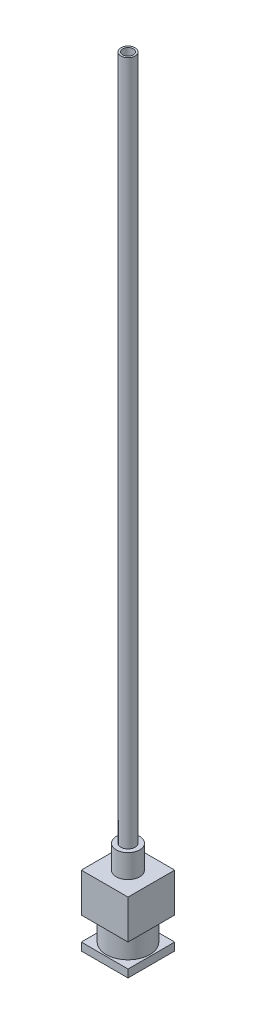
ISO-10303-21;
HEADER;
FILE_DESCRIPTION(('STEP AP214'),'2;1');
FILE_NAME('part.step','',(''),(''),'','','');
FILE_SCHEMA(('AUTOMOTIVE_DESIGN { 1 0 10303 214 1 1 1 1 }'));
ENDSEC;
DATA;
#1=APPLICATION_CONTEXT('core data for automotive mechanical design processes');
#2=APPLICATION_PROTOCOL_DEFINITION('international standard','automotive_design',2000,#1);
#3=PRODUCT_CONTEXT('',#1,'mechanical');
#4=PRODUCT('Part','Part','',(#3));
#5=PRODUCT_RELATED_PRODUCT_CATEGORY('part','',(#4));
#6=PRODUCT_DEFINITION_FORMATION('','',#4);
#7=PRODUCT_DEFINITION_CONTEXT('part definition',#1,'design');
#8=PRODUCT_DEFINITION('design','',#6,#7);
#9=PRODUCT_DEFINITION_SHAPE('','',#8);
#10=(LENGTH_UNIT() NAMED_UNIT(*) SI_UNIT(.MILLI.,.METRE.));
#11=(NAMED_UNIT(*) PLANE_ANGLE_UNIT() SI_UNIT($,.RADIAN.));
#12=(NAMED_UNIT(*) SI_UNIT($,.STERADIAN.) SOLID_ANGLE_UNIT());
#13=UNCERTAINTY_MEASURE_WITH_UNIT(LENGTH_MEASURE(1.E-05),#10,'distance_accuracy_value','');
#14=(GEOMETRIC_REPRESENTATION_CONTEXT(3) GLOBAL_UNCERTAINTY_ASSIGNED_CONTEXT((#13)) GLOBAL_UNIT_ASSIGNED_CONTEXT((#10,
#11,#12)) REPRESENTATION_CONTEXT('',''));
#15=CARTESIAN_POINT('',(0.,0.,0.));
#16=DIRECTION('',(0.,0.,1.));
#17=DIRECTION('',(1.,0.,0.));
#18=AXIS2_PLACEMENT_3D('',#15,#16,#17);
#19=CARTESIAN_POINT('',(-3.,9.,3.));
#20=DIRECTION('',(1.,0.,0.));
#21=DIRECTION('',(0.,0.,-1.));
#22=AXIS2_PLACEMENT_3D('',#19,#20,#21);
#23=PLANE('',#22);
#24=DIRECTION('',(0.,-1.,0.));
#25=VECTOR('',#24,1.);
#26=CARTESIAN_POINT('',(-3.,9.,3.));
#27=LINE('',#26,#25);
#28=CARTESIAN_POINT('',(-3.,1.,3.));
#29=VERTEX_POINT('',#28);
#30=CARTESIAN_POINT('',(-3.,0.,3.));
#31=VERTEX_POINT('',#30);
#32=EDGE_CURVE('E129',#29,#31,#27,.T.);
#33=ORIENTED_EDGE('',*,*,#32,.F.);
#34=DIRECTION('',(0.,0.,-1.));
#35=VECTOR('',#34,1.);
#36=CARTESIAN_POINT('',(-3.,1.,3.));
#37=LINE('',#36,#35);
#38=CARTESIAN_POINT('',(-3.,1.,-3.));
#39=VERTEX_POINT('',#38);
#40=EDGE_CURVE('E105',#29,#39,#37,.T.);
#41=ORIENTED_EDGE('',*,*,#40,.T.);
#42=DIRECTION('',(0.,-1.,0.));
#43=VECTOR('',#42,1.);
#44=CARTESIAN_POINT('',(-3.,9.,-3.));
#45=LINE('',#44,#43);
#46=CARTESIAN_POINT('',(-3.,0.,-3.));
#47=VERTEX_POINT('',#46);
#48=EDGE_CURVE('E147',#39,#47,#45,.T.);
#49=ORIENTED_EDGE('',*,*,#48,.T.);
#50=DIRECTION('',(0.,0.,1.));
#51=VECTOR('',#50,1.);
#52=CARTESIAN_POINT('',(-3.,0.,3.));
#53=LINE('',#52,#51);
#54=EDGE_CURVE('E143',#47,#31,#53,.T.);
#55=ORIENTED_EDGE('',*,*,#54,.T.);
#56=EDGE_LOOP('',(#33,#41,#49,#55));
#57=FACE_BOUND('',#56,.T.);
#58=ADVANCED_FACE('F37',(#57),#23,.F.);
#59=CARTESIAN_POINT('',(3.,9.,3.));
#60=DIRECTION('',(0.,0.,-1.));
#61=DIRECTION('',(-1.,0.,0.));
#62=AXIS2_PLACEMENT_3D('',#59,#60,#61);
#63=PLANE('',#62);
#64=DIRECTION('',(0.,-1.,0.));
#65=VECTOR('',#64,1.);
#66=CARTESIAN_POINT('',(3.,9.,3.));
#67=LINE('',#66,#65);
#68=CARTESIAN_POINT('',(3.,1.,3.));
#69=VERTEX_POINT('',#68);
#70=CARTESIAN_POINT('',(3.,0.,3.));
#71=VERTEX_POINT('',#70);
#72=EDGE_CURVE('E115',#69,#71,#67,.T.);
#73=ORIENTED_EDGE('',*,*,#72,.F.);
#74=DIRECTION('',(-1.,0.,0.));
#75=VECTOR('',#74,1.);
#76=CARTESIAN_POINT('',(3.,1.,3.));
#77=LINE('',#76,#75);
#78=EDGE_CURVE('E102',#69,#29,#77,.T.);
#79=ORIENTED_EDGE('',*,*,#78,.T.);
#80=ORIENTED_EDGE('',*,*,#32,.T.);
#81=DIRECTION('',(1.,0.,0.));
#82=VECTOR('',#81,1.);
#83=CARTESIAN_POINT('',(3.,0.,3.));
#84=LINE('',#83,#82);
#85=EDGE_CURVE('E123',#31,#71,#84,.T.);
#86=ORIENTED_EDGE('',*,*,#85,.T.);
#87=EDGE_LOOP('',(#73,#79,#80,#86));
#88=FACE_BOUND('',#87,.T.);
#89=ADVANCED_FACE('F121',(#88),#63,.F.);
#90=CARTESIAN_POINT('',(3.,9.,3.));
#91=DIRECTION('',(-1.,0.,0.));
#92=DIRECTION('',(0.,0.,1.));
#93=AXIS2_PLACEMENT_3D('',#90,#91,#92);
#94=PLANE('',#93);
#95=DIRECTION('',(0.,-1.,0.));
#96=VECTOR('',#95,1.);
#97=CARTESIAN_POINT('',(3.,9.,-3.));
#98=LINE('',#97,#96);
#99=CARTESIAN_POINT('',(3.,0.999999999999999,-3.));
#100=VERTEX_POINT('',#99);
#101=CARTESIAN_POINT('',(3.,0.,-3.));
#102=VERTEX_POINT('',#101);
#103=EDGE_CURVE('E117',#100,#102,#98,.T.);
#104=ORIENTED_EDGE('',*,*,#103,.F.);
#105=DIRECTION('',(0.,0.,1.));
#106=VECTOR('',#105,1.);
#107=CARTESIAN_POINT('',(3.,1.,-3.));
#108=LINE('',#107,#106);
#109=EDGE_CURVE('E54',#100,#69,#108,.T.);
#110=ORIENTED_EDGE('',*,*,#109,.T.);
#111=ORIENTED_EDGE('',*,*,#72,.T.);
#112=DIRECTION('',(0.,0.,-1.));
#113=VECTOR('',#112,1.);
#114=CARTESIAN_POINT('',(3.,0.,3.));
#115=LINE('',#114,#113);
#116=EDGE_CURVE('E144',#71,#102,#115,.T.);
#117=ORIENTED_EDGE('',*,*,#116,.T.);
#118=EDGE_LOOP('',(#104,#110,#111,#117));
#119=FACE_BOUND('',#118,.T.);
#120=ADVANCED_FACE('F113',(#119),#94,.F.);
#121=CARTESIAN_POINT('',(3.,9.,-3.));
#122=DIRECTION('',(0.,0.,1.));
#123=DIRECTION('',(1.,0.,0.));
#124=AXIS2_PLACEMENT_3D('',#121,#122,#123);
#125=PLANE('',#124);
#126=ORIENTED_EDGE('',*,*,#48,.F.);
#127=DIRECTION('',(1.,0.,0.));
#128=VECTOR('',#127,1.);
#129=CARTESIAN_POINT('',(-3.,1.,-3.));
#130=LINE('',#129,#128);
#131=EDGE_CURVE('E119',#39,#100,#130,.T.);
#132=ORIENTED_EDGE('',*,*,#131,.T.);
#133=ORIENTED_EDGE('',*,*,#103,.T.);
#134=DIRECTION('',(-1.,0.,0.));
#135=VECTOR('',#134,1.);
#136=CARTESIAN_POINT('',(3.,0.,-3.));
#137=LINE('',#136,#135);
#138=EDGE_CURVE('E159',#102,#47,#137,.T.);
#139=ORIENTED_EDGE('',*,*,#138,.T.);
#140=EDGE_LOOP('',(#126,#132,#133,#139));
#141=FACE_BOUND('',#140,.T.);
#142=ADVANCED_FACE('F203',(#141),#125,.F.);
#143=CARTESIAN_POINT('',(0.,0.,0.));
#144=DIRECTION('',(0.,1.,0.));
#145=DIRECTION('',(0.,0.,1.));
#146=AXIS2_PLACEMENT_3D('',#143,#144,#145);
#147=CYLINDRICAL_SURFACE('',#146,0.68);
#148=CARTESIAN_POINT('',(0.,100.,0.));
#149=DIRECTION('',(0.,1.,0.));
#150=DIRECTION('',(0.,0.,1.));
#151=AXIS2_PLACEMENT_3D('',#148,#149,#150);
#152=CIRCLE('',#151,0.68);
#153=CARTESIAN_POINT('',(0.,100.,0.68));
#154=VERTEX_POINT('',#153);
#155=EDGE_CURVE('E179',#154,#154,#152,.T.);
#156=ORIENTED_EDGE('',*,*,#155,.T.);
#157=EDGE_LOOP('',(#156));
#158=FACE_BOUND('',#157,.T.);
#159=CARTESIAN_POINT('',(0.,7.99999999999999,0.));
#160=DIRECTION('',(0.,-1.,0.));
#161=DIRECTION('',(0.,0.,-1.));
#162=AXIS2_PLACEMENT_3D('',#159,#160,#161);
#163=CIRCLE('',#162,0.68);
#164=CARTESIAN_POINT('',(0.,7.99999999999999,-0.68));
#165=VERTEX_POINT('',#164);
#166=EDGE_CURVE('E41',#165,#165,#163,.F.);
#167=ORIENTED_EDGE('',*,*,#166,.F.);
#168=EDGE_LOOP('',(#167));
#169=FACE_BOUND('',#168,.T.);
#170=ADVANCED_FACE('F205',(#158,#169),#147,.F.);
#171=CARTESIAN_POINT('',(0.,12.,0.));
#172=DIRECTION('',(0.,1.,0.));
#173=DIRECTION('',(0.,0.,1.));
#174=AXIS2_PLACEMENT_3D('',#171,#172,#173);
#175=PLANE('',#174);
#176=CARTESIAN_POINT('',(0.,12.,0.));
#177=DIRECTION('',(0.,1.,0.));
#178=DIRECTION('',(0.,0.,1.));
#179=AXIS2_PLACEMENT_3D('',#176,#177,#178);
#180=CIRCLE('',#179,1.5);
#181=CARTESIAN_POINT('',(0.,12.,1.5));
#182=VERTEX_POINT('',#181);
#183=EDGE_CURVE('E149',#182,#182,#180,.T.);
#184=ORIENTED_EDGE('',*,*,#183,.T.);
#185=EDGE_LOOP('',(#184));
#186=FACE_BOUND('',#185,.T.);
#187=CARTESIAN_POINT('',(0.,12.,0.));
#188=DIRECTION('',(0.,1.,0.));
#189=DIRECTION('',(0.,0.,1.));
#190=AXIS2_PLACEMENT_3D('',#187,#188,#189);
#191=CIRCLE('',#190,0.92);
#192=CARTESIAN_POINT('',(0.,12.,0.92));
#193=VERTEX_POINT('',#192);
#194=EDGE_CURVE('E176',#193,#193,#191,.T.);
#195=ORIENTED_EDGE('',*,*,#194,.F.);
#196=EDGE_LOOP('',(#195));
#197=FACE_BOUND('',#196,.T.);
#198=ADVANCED_FACE('F212',(#186,#197),#175,.T.);
#199=CARTESIAN_POINT('',(-3.,9.,-3.));
#200=VERTEX_POINT('',#199);
#201=CARTESIAN_POINT('',(-3.,4.,-3.));
#202=VERTEX_POINT('',#201);
#203=EDGE_CURVE('E161',#200,#202,#45,.T.);
#204=ORIENTED_EDGE('',*,*,#203,.T.);
#205=DIRECTION('',(0.,0.,-1.));
#206=VECTOR('',#205,1.);
#207=CARTESIAN_POINT('',(-3.,4.,3.));
#208=LINE('',#207,#206);
#209=CARTESIAN_POINT('',(-3.,4.,3.));
#210=VERTEX_POINT('',#209);
#211=EDGE_CURVE('E62',#210,#202,#208,.T.);
#212=ORIENTED_EDGE('',*,*,#211,.F.);
#213=CARTESIAN_POINT('',(-3.,9.,3.));
#214=VERTEX_POINT('',#213);
#215=EDGE_CURVE('E46',#214,#210,#27,.T.);
#216=ORIENTED_EDGE('',*,*,#215,.F.);
#217=DIRECTION('',(0.,0.,1.));
#218=VECTOR('',#217,1.);
#219=CARTESIAN_POINT('',(-3.,9.,3.));
#220=LINE('',#219,#218);
#221=EDGE_CURVE('E160',#200,#214,#220,.T.);
#222=ORIENTED_EDGE('',*,*,#221,.F.);
#223=EDGE_LOOP('',(#204,#212,#216,#222));
#224=FACE_BOUND('',#223,.T.);
#225=ADVANCED_FACE('F39',(#224),#23,.F.);
#226=ORIENTED_EDGE('',*,*,#215,.T.);
#227=DIRECTION('',(-1.,0.,0.));
#228=VECTOR('',#227,1.);
#229=CARTESIAN_POINT('',(3.,4.,3.));
#230=LINE('',#229,#228);
#231=CARTESIAN_POINT('',(3.,4.,3.));
#232=VERTEX_POINT('',#231);
#233=EDGE_CURVE('E194',#232,#210,#230,.T.);
#234=ORIENTED_EDGE('',*,*,#233,.F.);
#235=CARTESIAN_POINT('',(3.,9.,3.));
#236=VERTEX_POINT('',#235);
#237=EDGE_CURVE('E125',#236,#232,#67,.T.);
#238=ORIENTED_EDGE('',*,*,#237,.F.);
#239=DIRECTION('',(1.,0.,0.));
#240=VECTOR('',#239,1.);
#241=CARTESIAN_POINT('',(3.,9.,3.));
#242=LINE('',#241,#240);
#243=EDGE_CURVE('E170',#214,#236,#242,.T.);
#244=ORIENTED_EDGE('',*,*,#243,.F.);
#245=EDGE_LOOP('',(#226,#234,#238,#244));
#246=FACE_BOUND('',#245,.T.);
#247=ADVANCED_FACE('F225',(#246),#63,.F.);
#248=ORIENTED_EDGE('',*,*,#237,.T.);
#249=DIRECTION('',(0.,0.,1.));
#250=VECTOR('',#249,1.);
#251=CARTESIAN_POINT('',(3.,4.,-3.));
#252=LINE('',#251,#250);
#253=CARTESIAN_POINT('',(3.,4.,-3.));
#254=VERTEX_POINT('',#253);
#255=EDGE_CURVE('E192',#254,#232,#252,.T.);
#256=ORIENTED_EDGE('',*,*,#255,.F.);
#257=CARTESIAN_POINT('',(3.,9.,-3.));
#258=VERTEX_POINT('',#257);
#259=EDGE_CURVE('E126',#258,#254,#98,.T.);
#260=ORIENTED_EDGE('',*,*,#259,.F.);
#261=DIRECTION('',(0.,0.,-1.));
#262=VECTOR('',#261,1.);
#263=CARTESIAN_POINT('',(3.,9.,3.));
#264=LINE('',#263,#262);
#265=EDGE_CURVE('E166',#236,#258,#264,.T.);
#266=ORIENTED_EDGE('',*,*,#265,.F.);
#267=EDGE_LOOP('',(#248,#256,#260,#266));
#268=FACE_BOUND('',#267,.T.);
#269=ADVANCED_FACE('F216',(#268),#94,.F.);
#270=ORIENTED_EDGE('',*,*,#259,.T.);
#271=DIRECTION('',(1.,0.,0.));
#272=VECTOR('',#271,1.);
#273=CARTESIAN_POINT('',(-3.,4.,-3.));
#274=LINE('',#273,#272);
#275=EDGE_CURVE('E190',#202,#254,#274,.T.);
#276=ORIENTED_EDGE('',*,*,#275,.F.);
#277=ORIENTED_EDGE('',*,*,#203,.F.);
#278=DIRECTION('',(-1.,0.,0.));
#279=VECTOR('',#278,1.);
#280=CARTESIAN_POINT('',(3.,9.,-3.));
#281=LINE('',#280,#279);
#282=EDGE_CURVE('E155',#258,#200,#281,.T.);
#283=ORIENTED_EDGE('',*,*,#282,.F.);
#284=EDGE_LOOP('',(#270,#276,#277,#283));
#285=FACE_BOUND('',#284,.T.);
#286=ADVANCED_FACE('F207',(#285),#125,.F.);
#287=CARTESIAN_POINT('',(0.,9.,0.));
#288=DIRECTION('',(0.,1.,0.));
#289=DIRECTION('',(0.,0.,1.));
#290=AXIS2_PLACEMENT_3D('',#287,#288,#289);
#291=PLANE('',#290);
#292=CARTESIAN_POINT('',(0.,9.,0.));
#293=DIRECTION('',(0.,1.,0.));
#294=DIRECTION('',(0.,0.,1.));
#295=AXIS2_PLACEMENT_3D('',#292,#293,#294);
#296=CIRCLE('',#295,1.5);
#297=CARTESIAN_POINT('',(0.,9.,1.5));
#298=VERTEX_POINT('',#297);
#299=EDGE_CURVE('E12',#298,#298,#296,.T.);
#300=ORIENTED_EDGE('',*,*,#299,.F.);
#301=EDGE_LOOP('',(#300));
#302=FACE_BOUND('',#301,.T.);
#303=ORIENTED_EDGE('',*,*,#221,.T.);
#304=ORIENTED_EDGE('',*,*,#243,.T.);
#305=ORIENTED_EDGE('',*,*,#265,.T.);
#306=ORIENTED_EDGE('',*,*,#282,.T.);
#307=EDGE_LOOP('',(#303,#304,#305,#306));
#308=FACE_BOUND('',#307,.T.);
#309=ADVANCED_FACE('F219',(#302,#308),#291,.T.);
#310=CARTESIAN_POINT('',(0.,0.,0.));
#311=DIRECTION('',(0.,1.,0.));
#312=DIRECTION('',(0.,0.,1.));
#313=AXIS2_PLACEMENT_3D('',#310,#311,#312);
#314=PLANE('',#313);
#315=CARTESIAN_POINT('',(0.,0.,0.));
#316=DIRECTION('',(0.,-1.,0.));
#317=DIRECTION('',(0.,0.,-1.));
#318=AXIS2_PLACEMENT_3D('',#315,#316,#317);
#319=CIRCLE('',#318,2.);
#320=CARTESIAN_POINT('',(0.,0.,-2.));
#321=VERTEX_POINT('',#320);
#322=EDGE_CURVE('E184',#321,#321,#319,.T.);
#323=ORIENTED_EDGE('',*,*,#322,.F.);
#324=EDGE_LOOP('',(#323));
#325=FACE_BOUND('',#324,.T.);
#326=ORIENTED_EDGE('',*,*,#54,.F.);
#327=ORIENTED_EDGE('',*,*,#138,.F.);
#328=ORIENTED_EDGE('',*,*,#116,.F.);
#329=ORIENTED_EDGE('',*,*,#85,.F.);
#330=EDGE_LOOP('',(#326,#327,#328,#329));
#331=FACE_BOUND('',#330,.T.);
#332=ADVANCED_FACE('F141',(#325,#331),#314,.F.);
#333=CARTESIAN_POINT('',(0.,12.,0.));
#334=DIRECTION('',(0.,-1.,0.));
#335=DIRECTION('',(0.,0.,-1.));
#336=AXIS2_PLACEMENT_3D('',#333,#334,#335);
#337=CYLINDRICAL_SURFACE('',#336,1.5);
#338=ORIENTED_EDGE('',*,*,#183,.F.);
#339=EDGE_LOOP('',(#338));
#340=FACE_BOUND('',#339,.T.);
#341=ORIENTED_EDGE('',*,*,#299,.T.);
#342=EDGE_LOOP('',(#341));
#343=FACE_BOUND('',#342,.T.);
#344=ADVANCED_FACE('F238',(#340,#343),#337,.T.);
#345=CARTESIAN_POINT('',(0.,100.,0.));
#346=DIRECTION('',(0.,1.,0.));
#347=DIRECTION('',(0.,0.,1.));
#348=AXIS2_PLACEMENT_3D('',#345,#346,#347);
#349=PLANE('',#348);
#350=CARTESIAN_POINT('',(0.,100.,0.));
#351=DIRECTION('',(0.,1.,0.));
#352=DIRECTION('',(0.,0.,1.));
#353=AXIS2_PLACEMENT_3D('',#350,#351,#352);
#354=CIRCLE('',#353,0.92);
#355=CARTESIAN_POINT('',(0.,100.,0.92));
#356=VERTEX_POINT('',#355);
#357=EDGE_CURVE('E152',#356,#356,#354,.T.);
#358=ORIENTED_EDGE('',*,*,#357,.T.);
#359=EDGE_LOOP('',(#358));
#360=FACE_BOUND('',#359,.T.);
#361=ORIENTED_EDGE('',*,*,#155,.F.);
#362=EDGE_LOOP('',(#361));
#363=FACE_BOUND('',#362,.T.);
#364=ADVANCED_FACE('F241',(#360,#363),#349,.T.);
#365=CARTESIAN_POINT('',(0.,100.,0.));
#366=DIRECTION('',(0.,-1.,0.));
#367=DIRECTION('',(0.,0.,-1.));
#368=AXIS2_PLACEMENT_3D('',#365,#366,#367);
#369=CYLINDRICAL_SURFACE('',#368,0.92);
#370=ORIENTED_EDGE('',*,*,#357,.F.);
#371=EDGE_LOOP('',(#370));
#372=FACE_BOUND('',#371,.T.);
#373=ORIENTED_EDGE('',*,*,#194,.T.);
#374=EDGE_LOOP('',(#373));
#375=FACE_BOUND('',#374,.T.);
#376=ADVANCED_FACE('F263',(#372,#375),#369,.T.);
#377=CARTESIAN_POINT('',(0.,7.99999999999999,0.));
#378=DIRECTION('',(0.,-1.,0.));
#379=DIRECTION('',(0.,0.,-1.));
#380=AXIS2_PLACEMENT_3D('',#377,#378,#379);
#381=PLANE('',#380);
#382=CARTESIAN_POINT('',(0.,7.99999999999999,0.));
#383=DIRECTION('',(0.,-1.,0.));
#384=DIRECTION('',(0.,0.,-1.));
#385=AXIS2_PLACEMENT_3D('',#382,#383,#384);
#386=CIRCLE('',#385,2.);
#387=CARTESIAN_POINT('',(0.,7.99999999999999,-2.));
#388=VERTEX_POINT('',#387);
#389=EDGE_CURVE('E187',#388,#388,#386,.T.);
#390=ORIENTED_EDGE('',*,*,#389,.T.);
#391=EDGE_LOOP('',(#390));
#392=FACE_BOUND('',#391,.T.);
#393=ORIENTED_EDGE('',*,*,#166,.T.);
#394=EDGE_LOOP('',(#393));
#395=FACE_BOUND('',#394,.T.);
#396=ADVANCED_FACE('F254',(#392,#395),#381,.T.);
#397=CARTESIAN_POINT('',(0.,7.99999999999999,0.));
#398=DIRECTION('',(0.,-1.,0.));
#399=DIRECTION('',(0.,0.,-1.));
#400=AXIS2_PLACEMENT_3D('',#397,#398,#399);
#401=CYLINDRICAL_SURFACE('',#400,2.);
#402=ORIENTED_EDGE('',*,*,#389,.F.);
#403=EDGE_LOOP('',(#402));
#404=FACE_BOUND('',#403,.T.);
#405=ORIENTED_EDGE('',*,*,#322,.T.);
#406=EDGE_LOOP('',(#405));
#407=FACE_BOUND('',#406,.T.);
#408=ADVANCED_FACE('F251',(#404,#407),#401,.F.);
#409=CARTESIAN_POINT('',(0.,16.4852813742386,0.));
#410=DIRECTION('',(0.,-1.,0.));
#411=DIRECTION('',(0.,0.,-1.));
#412=AXIS2_PLACEMENT_3D('',#409,#410,#411);
#413=CYLINDRICAL_SURFACE('',#412,2.8);
#414=CARTESIAN_POINT('',(0.,1.,0.));
#415=DIRECTION('',(0.,-1.,0.));
#416=DIRECTION('',(0.,0.,-1.));
#417=AXIS2_PLACEMENT_3D('',#414,#415,#416);
#418=CIRCLE('',#417,2.8);
#419=CARTESIAN_POINT('',(0.,1.,-2.8));
#420=VERTEX_POINT('',#419);
#421=EDGE_CURVE('E109',#420,#420,#418,.T.);
#422=ORIENTED_EDGE('',*,*,#421,.F.);
#423=EDGE_LOOP('',(#422));
#424=FACE_BOUND('',#423,.T.);
#425=CARTESIAN_POINT('',(0.,4.,0.));
#426=DIRECTION('',(0.,1.,0.));
#427=DIRECTION('',(0.,0.,1.));
#428=AXIS2_PLACEMENT_3D('',#425,#426,#427);
#429=CIRCLE('',#428,2.8);
#430=CARTESIAN_POINT('',(0.,4.,2.8));
#431=VERTEX_POINT('',#430);
#432=EDGE_CURVE('E118',#431,#431,#429,.F.);
#433=ORIENTED_EDGE('',*,*,#432,.T.);
#434=EDGE_LOOP('',(#433));
#435=FACE_BOUND('',#434,.T.);
#436=ADVANCED_FACE('F253',(#424,#435),#413,.T.);
#437=CARTESIAN_POINT('',(0.,1.,0.));
#438=DIRECTION('',(0.,-1.,0.));
#439=DIRECTION('',(0.,0.,-1.));
#440=AXIS2_PLACEMENT_3D('',#437,#438,#439);
#441=PLANE('',#440);
#442=ORIENTED_EDGE('',*,*,#421,.T.);
#443=EDGE_LOOP('',(#442));
#444=FACE_BOUND('',#443,.T.);
#445=ORIENTED_EDGE('',*,*,#78,.F.);
#446=ORIENTED_EDGE('',*,*,#109,.F.);
#447=ORIENTED_EDGE('',*,*,#131,.F.);
#448=ORIENTED_EDGE('',*,*,#40,.F.);
#449=EDGE_LOOP('',(#445,#446,#447,#448));
#450=FACE_BOUND('',#449,.T.);
#451=ADVANCED_FACE('F103',(#444,#450),#441,.F.);
#452=CARTESIAN_POINT('',(0.,4.,0.));
#453=DIRECTION('',(0.,1.,0.));
#454=DIRECTION('',(0.,0.,1.));
#455=AXIS2_PLACEMENT_3D('',#452,#453,#454);
#456=PLANE('',#455);
#457=ORIENTED_EDGE('',*,*,#233,.T.);
#458=ORIENTED_EDGE('',*,*,#211,.T.);
#459=ORIENTED_EDGE('',*,*,#275,.T.);
#460=ORIENTED_EDGE('',*,*,#255,.T.);
#461=EDGE_LOOP('',(#457,#458,#459,#460));
#462=FACE_BOUND('',#461,.T.);
#463=ORIENTED_EDGE('',*,*,#432,.F.);
#464=EDGE_LOOP('',(#463));
#465=FACE_BOUND('',#464,.T.);
#466=ADVANCED_FACE('F358',(#462,#465),#456,.F.);
#467=CLOSED_SHELL('',(#58,#89,#120,#142,#170,#198,#225,#247,#269,#286,#309,#332,#344,#364,#376,
#396,#408,#436,#451,#466));
#468=MANIFOLD_SOLID_BREP('B2',#467);
#469=ADVANCED_BREP_SHAPE_REPRESENTATION('',(#18,#468),#14);
#470=SHAPE_DEFINITION_REPRESENTATION(#9,#469);
ENDSEC;
END-ISO-10303-21;
